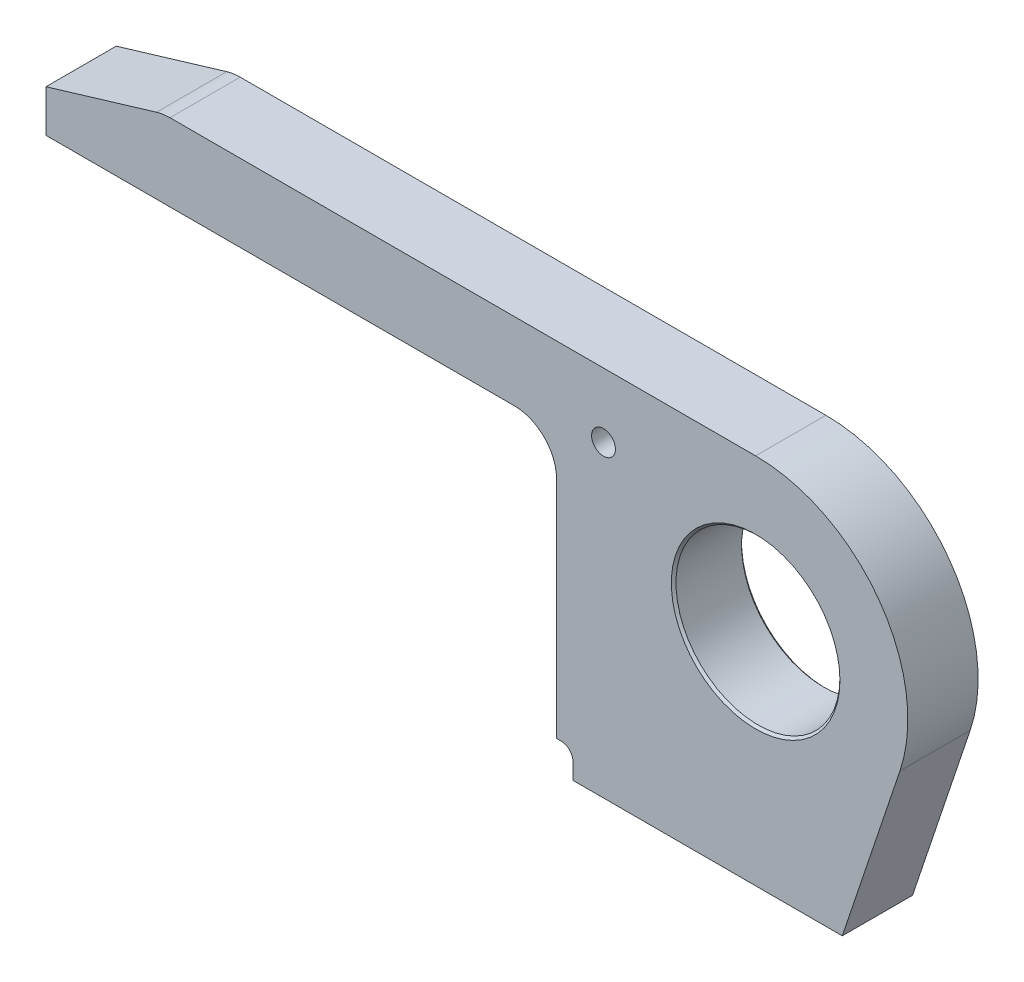
ISO-10303-21;
HEADER;
FILE_DESCRIPTION(('STEP AP214'),'2;1');
FILE_NAME('part.step','',(''),(''),'','','');
FILE_SCHEMA(('AUTOMOTIVE_DESIGN { 1 0 10303 214 1 1 1 1 }'));
ENDSEC;
DATA;
#1=APPLICATION_CONTEXT('core data for automotive mechanical design processes');
#2=APPLICATION_PROTOCOL_DEFINITION('international standard','automotive_design',2000,#1);
#3=PRODUCT_CONTEXT('',#1,'mechanical');
#4=PRODUCT('Part','Part','',(#3));
#5=PRODUCT_RELATED_PRODUCT_CATEGORY('part','',(#4));
#6=PRODUCT_DEFINITION_FORMATION('','',#4);
#7=PRODUCT_DEFINITION_CONTEXT('part definition',#1,'design');
#8=PRODUCT_DEFINITION('design','',#6,#7);
#9=PRODUCT_DEFINITION_SHAPE('','',#8);
#10=(LENGTH_UNIT() NAMED_UNIT(*) SI_UNIT(.MILLI.,.METRE.));
#11=(NAMED_UNIT(*) PLANE_ANGLE_UNIT() SI_UNIT($,.RADIAN.));
#12=(NAMED_UNIT(*) SI_UNIT($,.STERADIAN.) SOLID_ANGLE_UNIT());
#13=UNCERTAINTY_MEASURE_WITH_UNIT(LENGTH_MEASURE(1.E-05),#10,'distance_accuracy_value','');
#14=(GEOMETRIC_REPRESENTATION_CONTEXT(3) GLOBAL_UNCERTAINTY_ASSIGNED_CONTEXT((#13)) GLOBAL_UNIT_ASSIGNED_CONTEXT((#10,
#11,#12)) REPRESENTATION_CONTEXT('',''));
#15=CARTESIAN_POINT('',(0.,0.,0.));
#16=DIRECTION('',(0.,0.,1.));
#17=DIRECTION('',(1.,0.,0.));
#18=AXIS2_PLACEMENT_3D('',#15,#16,#17);
#19=CARTESIAN_POINT('',(-303.,27.0000000000002,-30.0000000000006));
#20=DIRECTION('',(0.,-1.,0.));
#21=DIRECTION('',(0.,0.,-1.00000000000001));
#22=AXIS2_PLACEMENT_3D('',#19,#20,#21);
#23=PLANE('',#22);
#24=DIRECTION('',(0.,0.,1.00000000000001));
#25=VECTOR('',#24,1.);
#26=CARTESIAN_POINT('',(-303.,27.0000000000002,-30.0000000000006));
#27=LINE('',#26,#25);
#28=CARTESIAN_POINT('',(-303.,27.0000000000002,-25.0000000000004));
#29=VERTEX_POINT('',#28);
#30=CARTESIAN_POINT('',(-303.,27.0000000000002,-5.00000000000056));
#31=VERTEX_POINT('',#30);
#32=EDGE_CURVE('E1529',#29,#31,#27,.T.);
#33=ORIENTED_EDGE('',*,*,#32,.F.);
#34=DIRECTION('',(1.,0.,0.));
#35=VECTOR('',#34,1.);
#36=CARTESIAN_POINT('',(-103.,27.0000000000001,-25.0000000000003));
#37=LINE('',#36,#35);
#38=CARTESIAN_POINT('',(-103.,27.0000000000001,-25.0000000000003));
#39=VERTEX_POINT('',#38);
#40=EDGE_CURVE('E1564',#29,#39,#37,.T.);
#41=ORIENTED_EDGE('',*,*,#40,.T.);
#42=DIRECTION('',(0.,0.,1.00000000000001));
#43=VECTOR('',#42,1.);
#44=CARTESIAN_POINT('',(-103.,27.0000000000001,-2.22044604925031E-13));
#45=LINE('',#44,#43);
#46=CARTESIAN_POINT('',(-103.,27.0000000000001,-5.00000000000034));
#47=VERTEX_POINT('',#46);
#48=EDGE_CURVE('E1549',#39,#47,#45,.T.);
#49=ORIENTED_EDGE('',*,*,#48,.T.);
#50=DIRECTION('',(-1.,0.,0.));
#51=VECTOR('',#50,1.);
#52=CARTESIAN_POINT('',(-303.,27.0000000000002,-5.00000000000056));
#53=LINE('',#52,#51);
#54=EDGE_CURVE('E1562',#47,#31,#53,.T.);
#55=ORIENTED_EDGE('',*,*,#54,.T.);
#56=EDGE_LOOP('',(#33,#41,#49,#55));
#57=FACE_BOUND('',#56,.T.);
#58=ADVANCED_FACE('F1349',(#57),#23,.T.);
#59=CARTESIAN_POINT('',(-303.,50.0000000000002,-30.0000000000006));
#60=DIRECTION('',(-1.,0.,0.));
#61=DIRECTION('',(0.,0.,1.00000000000001));
#62=AXIS2_PLACEMENT_3D('',#59,#60,#61);
#63=PLANE('',#62);
#64=DIRECTION('',(0.,-1.,0.));
#65=VECTOR('',#64,1.);
#66=CARTESIAN_POINT('',(-303.,50.0000000000002,-30.0000000000006));
#67=LINE('',#66,#65);
#68=CARTESIAN_POINT('',(-303.,50.0000000000002,-30.0000000000006));
#69=VERTEX_POINT('',#68);
#70=CARTESIAN_POINT('',(-303.,32.0000000000002,-30.0000000000006));
#71=VERTEX_POINT('',#70);
#72=EDGE_CURVE('E1488',#69,#71,#67,.T.);
#73=ORIENTED_EDGE('',*,*,#72,.T.);
#74=DIRECTION('',(0.,-0.707106781186544,0.707106781186556));
#75=VECTOR('',#74,1.);
#76=CARTESIAN_POINT('',(-303.000000000001,41.0000000000001,-39.0000000000004));
#77=LINE('',#76,#75);
#78=EDGE_CURVE('E1575',#71,#29,#77,.T.);
#79=ORIENTED_EDGE('',*,*,#78,.T.);
#80=ORIENTED_EDGE('',*,*,#32,.T.);
#81=DIRECTION('',(0.,-0.707106781186544,-0.707106781186556));
#82=VECTOR('',#81,1.);
#83=CARTESIAN_POINT('',(-303.000000000001,26.0000000000001,-6.00000000000067));
#84=LINE('',#83,#82);
#85=CARTESIAN_POINT('',(-303.,32.0000000000002,0.));
#86=VERTEX_POINT('',#85);
#87=EDGE_CURVE('E1573',#31,#86,#84,.F.);
#88=ORIENTED_EDGE('',*,*,#87,.T.);
#89=DIRECTION('',(0.,-1.,0.));
#90=VECTOR('',#89,1.);
#91=CARTESIAN_POINT('',(-303.,50.0000000000002,0.));
#92=LINE('',#91,#90);
#93=CARTESIAN_POINT('',(-303.,50.0000000000002,0.));
#94=VERTEX_POINT('',#93);
#95=EDGE_CURVE('E1526',#94,#86,#92,.T.);
#96=ORIENTED_EDGE('',*,*,#95,.F.);
#97=DIRECTION('',(0.,0.,1.00000000000001));
#98=VECTOR('',#97,1.);
#99=CARTESIAN_POINT('',(-303.,50.0000000000002,-30.0000000000006));
#100=LINE('',#99,#98);
#101=EDGE_CURVE('E1533',#69,#94,#100,.T.);
#102=ORIENTED_EDGE('',*,*,#101,.F.);
#103=EDGE_LOOP('',(#73,#79,#80,#88,#96,#102));
#104=FACE_BOUND('',#103,.T.);
#105=ADVANCED_FACE('F1688',(#104),#63,.T.);
#106=CARTESIAN_POINT('',(-303.,50.0000000000002,-30.0000000000006));
#107=DIRECTION('',(-0.287347885566347,0.957826285221151,0.));
#108=DIRECTION('',(-0.957826285221152,-0.287347885566345,0.));
#109=AXIS2_PLACEMENT_3D('',#106,#107,#108);
#110=PLANE('',#109);
#111=DIRECTION('',(-0.957826285221152,-0.287347885566345,0.));
#112=VECTOR('',#111,1.);
#113=CARTESIAN_POINT('',(-303.,50.0000000000002,0.));
#114=LINE('',#113,#112);
#115=CARTESIAN_POINT('',(-255.811580985257,64.1565257044233,0.));
#116=VERTEX_POINT('',#115);
#117=EDGE_CURVE('E1524',#116,#94,#114,.T.);
#118=ORIENTED_EDGE('',*,*,#117,.F.);
#119=DIRECTION('',(0.,0.,1.00000000000001));
#120=VECTOR('',#119,1.);
#121=CARTESIAN_POINT('',(-255.811580985257,64.1565257044233,-30.0000000000006));
#122=LINE('',#121,#120);
#123=CARTESIAN_POINT('',(-255.811580985257,64.1565257044233,-30.0000000000006));
#124=VERTEX_POINT('',#123);
#125=EDGE_CURVE('E1545',#116,#124,#122,.F.);
#126=ORIENTED_EDGE('',*,*,#125,.T.);
#127=DIRECTION('',(-0.957826285221152,-0.287347885566345,0.));
#128=VECTOR('',#127,1.);
#129=CARTESIAN_POINT('',(-303.,50.0000000000002,-30.0000000000006));
#130=LINE('',#129,#128);
#131=EDGE_CURVE('E1505',#124,#69,#130,.T.);
#132=ORIENTED_EDGE('',*,*,#131,.T.);
#133=ORIENTED_EDGE('',*,*,#101,.T.);
#134=EDGE_LOOP('',(#118,#126,#132,#133));
#135=FACE_BOUND('',#134,.T.);
#136=ADVANCED_FACE('F1722',(#135),#110,.T.);
#137=CARTESIAN_POINT('',(0.,65.0000000000001,-30.0000000000001));
#138=DIRECTION('',(0.,1.,0.));
#139=DIRECTION('',(-1.,0.,0.));
#140=AXIS2_PLACEMENT_3D('',#137,#138,#139);
#141=PLANE('',#140);
#142=DIRECTION('',(-1.,0.,0.));
#143=VECTOR('',#142,1.);
#144=CARTESIAN_POINT('',(0.,65.0000000000001,-30.0000000000001));
#145=LINE('',#144,#143);
#146=CARTESIAN_POINT('',(0.,65.0000000000001,-30.0000000000001));
#147=VERTEX_POINT('',#146);
#148=CARTESIAN_POINT('',(-250.06462327393,65.0000000000002,-30.0000000000002));
#149=VERTEX_POINT('',#148);
#150=EDGE_CURVE('E1502',#147,#149,#145,.T.);
#151=ORIENTED_EDGE('',*,*,#150,.T.);
#152=DIRECTION('',(0.,0.,1.00000000000001));
#153=VECTOR('',#152,1.);
#154=CARTESIAN_POINT('',(-250.06462327393,65.0000000000002,-30.0000000000002));
#155=LINE('',#154,#153);
#156=CARTESIAN_POINT('',(-250.06462327393,65.0000000000002,0.));
#157=VERTEX_POINT('',#156);
#158=EDGE_CURVE('E1532',#149,#157,#155,.T.);
#159=ORIENTED_EDGE('',*,*,#158,.T.);
#160=DIRECTION('',(-1.,0.,0.));
#161=VECTOR('',#160,1.);
#162=CARTESIAN_POINT('',(0.,65.0000000000001,0.));
#163=LINE('',#162,#161);
#164=CARTESIAN_POINT('',(0.,65.0000000000001,0.));
#165=VERTEX_POINT('',#164);
#166=EDGE_CURVE('E1521',#165,#157,#163,.T.);
#167=ORIENTED_EDGE('',*,*,#166,.F.);
#168=DIRECTION('',(0.,0.,1.00000000000001));
#169=VECTOR('',#168,1.);
#170=CARTESIAN_POINT('',(0.,65.0000000000001,-30.0000000000001));
#171=LINE('',#170,#169);
#172=EDGE_CURVE('E1536',#147,#165,#171,.T.);
#173=ORIENTED_EDGE('',*,*,#172,.F.);
#174=EDGE_LOOP('',(#151,#159,#167,#173));
#175=FACE_BOUND('',#174,.T.);
#176=ADVANCED_FACE('F1701',(#175),#141,.T.);
#177=CARTESIAN_POINT('',(0.,0.,-30.0000000000001));
#178=DIRECTION('',(0.,0.,1.00000000000001));
#179=DIRECTION('',(1.,0.,0.));
#180=AXIS2_PLACEMENT_3D('',#177,#178,#179);
#181=CYLINDRICAL_SURFACE('',#180,65.);
#182=CARTESIAN_POINT('',(0.,0.,0.));
#183=DIRECTION('',(0.,0.,1.00000000000001));
#184=DIRECTION('',(1.,0.,0.));
#185=AXIS2_PLACEMENT_3D('',#182,#183,#184);
#186=CIRCLE('',#185,65.);
#187=CARTESIAN_POINT('',(61.6182370278482,-20.6928215954215,0.));
#188=VERTEX_POINT('',#187);
#189=EDGE_CURVE('E1518',#188,#165,#186,.T.);
#190=ORIENTED_EDGE('',*,*,#189,.F.);
#191=DIRECTION('',(0.,0.,1.00000000000001));
#192=VECTOR('',#191,1.);
#193=CARTESIAN_POINT('',(61.6182370278482,-20.6928215954215,-30.0000000000004));
#194=LINE('',#193,#192);
#195=CARTESIAN_POINT('',(61.6182370278482,-20.6928215954215,-30.0000000000004));
#196=VERTEX_POINT('',#195);
#197=EDGE_CURVE('E1538',#196,#188,#194,.T.);
#198=ORIENTED_EDGE('',*,*,#197,.F.);
#199=CARTESIAN_POINT('',(0.,0.,-30.0000000000001));
#200=DIRECTION('',(0.,0.,1.00000000000001));
#201=DIRECTION('',(1.,0.,0.));
#202=AXIS2_PLACEMENT_3D('',#199,#200,#201);
#203=CIRCLE('',#202,65.);
#204=EDGE_CURVE('E1496',#196,#147,#203,.T.);
#205=ORIENTED_EDGE('',*,*,#204,.T.);
#206=ORIENTED_EDGE('',*,*,#172,.T.);
#207=EDGE_LOOP('',(#190,#198,#205,#206));
#208=FACE_BOUND('',#207,.T.);
#209=ADVANCED_FACE('F1706',(#208),#181,.T.);
#210=CARTESIAN_POINT('',(37.0000000000008,-93.9999999999998,-30.0000000000002));
#211=DIRECTION('',(0.947972877351507,-0.318351101468024,0.));
#212=DIRECTION('',(0.318351101468023,0.947972877351508,0.));
#213=AXIS2_PLACEMENT_3D('',#210,#211,#212);
#214=PLANE('',#213);
#215=DIRECTION('',(0.318351101468022,0.947972877351508,0.));
#216=VECTOR('',#215,1.);
#217=CARTESIAN_POINT('',(37.0000000000008,-93.9999999999998,0.));
#218=LINE('',#217,#216);
#219=CARTESIAN_POINT('',(37.0000000000008,-93.9999999999998,0.));
#220=VERTEX_POINT('',#219);
#221=EDGE_CURVE('E1515',#220,#188,#218,.T.);
#222=ORIENTED_EDGE('',*,*,#221,.F.);
#223=DIRECTION('',(0.,0.,1.00000000000001));
#224=VECTOR('',#223,1.);
#225=CARTESIAN_POINT('',(37.0000000000008,-93.9999999999998,-30.0000000000002));
#226=LINE('',#225,#224);
#227=CARTESIAN_POINT('',(37.0000000000008,-93.9999999999998,-30.0000000000002));
#228=VERTEX_POINT('',#227);
#229=EDGE_CURVE('E1487',#228,#220,#226,.T.);
#230=ORIENTED_EDGE('',*,*,#229,.F.);
#231=DIRECTION('',(0.318351101468022,0.947972877351508,0.));
#232=VECTOR('',#231,1.);
#233=CARTESIAN_POINT('',(37.0000000000008,-93.9999999999998,-30.0000000000002));
#234=LINE('',#233,#232);
#235=EDGE_CURVE('E1494',#228,#196,#234,.T.);
#236=ORIENTED_EDGE('',*,*,#235,.T.);
#237=ORIENTED_EDGE('',*,*,#197,.T.);
#238=EDGE_LOOP('',(#222,#230,#236,#237));
#239=FACE_BOUND('',#238,.T.);
#240=ADVANCED_FACE('F1708',(#239),#214,.T.);
#241=CARTESIAN_POINT('',(-77.999999999999,-93.9999999999995,-30.0000000000004));
#242=DIRECTION('',(0.,-1.,0.));
#243=DIRECTION('',(0.,0.,-1.00000000000001));
#244=AXIS2_PLACEMENT_3D('',#241,#242,#243);
#245=PLANE('',#244);
#246=DIRECTION('',(1.,0.,0.));
#247=VECTOR('',#246,1.);
#248=CARTESIAN_POINT('',(-77.999999999999,-93.9999999999995,-2.22044604925031E-13));
#249=LINE('',#248,#247);
#250=CARTESIAN_POINT('',(-77.999999999999,-93.9999999999995,-2.22044604925031E-13));
#251=VERTEX_POINT('',#250);
#252=EDGE_CURVE('E1486',#251,#220,#249,.T.);
#253=ORIENTED_EDGE('',*,*,#252,.F.);
#254=DIRECTION('',(0.,0.,1.00000000000001));
#255=VECTOR('',#254,1.);
#256=CARTESIAN_POINT('',(-77.999999999999,-93.9999999999995,-30.0000000000004));
#257=LINE('',#256,#255);
#258=CARTESIAN_POINT('',(-77.999999999999,-93.9999999999995,-30.0000000000004));
#259=VERTEX_POINT('',#258);
#260=EDGE_CURVE('E1471',#259,#251,#257,.T.);
#261=ORIENTED_EDGE('',*,*,#260,.F.);
#262=DIRECTION('',(1.,0.,0.));
#263=VECTOR('',#262,1.);
#264=CARTESIAN_POINT('',(-77.999999999999,-93.9999999999995,-30.0000000000004));
#265=LINE('',#264,#263);
#266=EDGE_CURVE('E1479',#259,#228,#265,.T.);
#267=ORIENTED_EDGE('',*,*,#266,.T.);
#268=ORIENTED_EDGE('',*,*,#229,.T.);
#269=EDGE_LOOP('',(#253,#261,#267,#268));
#270=FACE_BOUND('',#269,.T.);
#271=ADVANCED_FACE('F1484',(#270),#245,.T.);
#272=CARTESIAN_POINT('',(-77.999999999999,-81.9999999999996,-30.0000000000004));
#273=DIRECTION('',(-1.,0.,0.));
#274=DIRECTION('',(0.,0.,1.00000000000001));
#275=AXIS2_PLACEMENT_3D('',#272,#273,#274);
#276=PLANE('',#275);
#277=DIRECTION('',(0.,-1.,0.));
#278=VECTOR('',#277,1.);
#279=CARTESIAN_POINT('',(-77.999999999999,-81.9999999999996,-2.22044604925031E-13));
#280=LINE('',#279,#278);
#281=CARTESIAN_POINT('',(-77.999999999999,-86.9999999999996,-2.22044604925031E-13));
#282=VERTEX_POINT('',#281);
#283=EDGE_CURVE('E1511',#282,#251,#280,.T.);
#284=ORIENTED_EDGE('',*,*,#283,.F.);
#285=DIRECTION('',(0.,0.,1.00000000000001));
#286=VECTOR('',#285,1.);
#287=CARTESIAN_POINT('',(-77.999999999999,-86.9999999999996,-30.0000000000004));
#288=LINE('',#287,#286);
#289=CARTESIAN_POINT('',(-77.999999999999,-86.9999999999996,-30.0000000000004));
#290=VERTEX_POINT('',#289);
#291=EDGE_CURVE('E1474',#282,#290,#288,.F.);
#292=ORIENTED_EDGE('',*,*,#291,.T.);
#293=DIRECTION('',(0.,-1.,0.));
#294=VECTOR('',#293,1.);
#295=CARTESIAN_POINT('',(-77.999999999999,-81.9999999999996,-30.0000000000004));
#296=LINE('',#295,#294);
#297=EDGE_CURVE('E1467',#290,#259,#296,.T.);
#298=ORIENTED_EDGE('',*,*,#297,.T.);
#299=ORIENTED_EDGE('',*,*,#260,.T.);
#300=EDGE_LOOP('',(#284,#292,#298,#299));
#301=FACE_BOUND('',#300,.T.);
#302=ADVANCED_FACE('F1470',(#301),#276,.T.);
#303=CARTESIAN_POINT('',(-89.999999999999,-82.,-30.0000000000004));
#304=DIRECTION('',(0.,-1.,0.));
#305=DIRECTION('',(0.,0.,-1.00000000000001));
#306=AXIS2_PLACEMENT_3D('',#303,#304,#305);
#307=PLANE('',#306);
#308=DIRECTION('',(1.,0.,0.));
#309=VECTOR('',#308,1.);
#310=CARTESIAN_POINT('',(-89.999999999999,-82.,-2.22044604925031E-13));
#311=LINE('',#310,#309);
#312=CARTESIAN_POINT('',(-84.9999999999991,-82.,-4.44089209850063E-13));
#313=VERTEX_POINT('',#312);
#314=CARTESIAN_POINT('',(-82.9999999999993,-82.,-4.44089209850063E-13));
#315=VERTEX_POINT('',#314);
#316=EDGE_CURVE('E1509',#313,#315,#311,.T.);
#317=ORIENTED_EDGE('',*,*,#316,.F.);
#318=DIRECTION('',(0.,0.,-1.00000000000001));
#319=VECTOR('',#318,1.);
#320=CARTESIAN_POINT('',(-84.9999999999991,-82.,-30.0000000000006));
#321=LINE('',#320,#319);
#322=CARTESIAN_POINT('',(-84.9999999999991,-82.,-30.0000000000006));
#323=VERTEX_POINT('',#322);
#324=EDGE_CURVE('E1591',#313,#323,#321,.T.);
#325=ORIENTED_EDGE('',*,*,#324,.T.);
#326=DIRECTION('',(1.,0.,0.));
#327=VECTOR('',#326,1.);
#328=CARTESIAN_POINT('',(-89.999999999999,-82.,-30.0000000000004));
#329=LINE('',#328,#327);
#330=CARTESIAN_POINT('',(-82.9999999999993,-82.,-30.0000000000006));
#331=VERTEX_POINT('',#330);
#332=EDGE_CURVE('E1480',#323,#331,#329,.T.);
#333=ORIENTED_EDGE('',*,*,#332,.T.);
#334=DIRECTION('',(0.,0.,1.00000000000001));
#335=VECTOR('',#334,1.);
#336=CARTESIAN_POINT('',(-82.9999999999993,-82.,-4.44089209850063E-13));
#337=LINE('',#336,#335);
#338=EDGE_CURVE('E1554',#331,#315,#337,.T.);
#339=ORIENTED_EDGE('',*,*,#338,.T.);
#340=EDGE_LOOP('',(#317,#325,#333,#339));
#341=FACE_BOUND('',#340,.T.);
#342=ADVANCED_FACE('F1642',(#341),#307,.T.);
#343=CARTESIAN_POINT('',(-89.9999999999999,27.0000000000001,-30.0000000000004));
#344=DIRECTION('',(-1.,0.,0.));
#345=DIRECTION('',(0.,-1.,0.));
#346=AXIS2_PLACEMENT_3D('',#343,#344,#345);
#347=PLANE('',#346);
#348=DIRECTION('',(0.,0.,1.00000000000001));
#349=VECTOR('',#348,1.);
#350=CARTESIAN_POINT('',(-89.9999999999999,14.0000000000002,-30.0000000000004));
#351=LINE('',#350,#349);
#352=CARTESIAN_POINT('',(-90.0000000000001,14.0000000000001,-5.00000000000034));
#353=VERTEX_POINT('',#352);
#354=CARTESIAN_POINT('',(-89.9999999999999,14.0000000000001,-25.0000000000002));
#355=VERTEX_POINT('',#354);
#356=EDGE_CURVE('E1552',#353,#355,#351,.F.);
#357=ORIENTED_EDGE('',*,*,#356,.T.);
#358=DIRECTION('',(0.,-1.,0.));
#359=VECTOR('',#358,1.);
#360=CARTESIAN_POINT('',(-89.9999999999999,-82.,-25.0000000000002));
#361=LINE('',#360,#359);
#362=CARTESIAN_POINT('',(-89.9999999999999,-77.,-25.0000000000002));
#363=VERTEX_POINT('',#362);
#364=EDGE_CURVE('E1364',#355,#363,#361,.T.);
#365=ORIENTED_EDGE('',*,*,#364,.T.);
#366=DIRECTION('',(0.,0.,1.00000000000001));
#367=VECTOR('',#366,1.);
#368=CARTESIAN_POINT('',(-89.999999999999,-77.,-30.0000000000004));
#369=LINE('',#368,#367);
#370=CARTESIAN_POINT('',(-89.9999999999999,-77.,-5.00000000000034));
#371=VERTEX_POINT('',#370);
#372=EDGE_CURVE('E1368',#363,#371,#369,.T.);
#373=ORIENTED_EDGE('',*,*,#372,.T.);
#374=DIRECTION('',(0.,1.,0.));
#375=VECTOR('',#374,1.);
#376=CARTESIAN_POINT('',(-89.9999999999999,27.0000000000001,-5.00000000000034));
#377=LINE('',#376,#375);
#378=EDGE_CURVE('E1587',#371,#353,#377,.T.);
#379=ORIENTED_EDGE('',*,*,#378,.T.);
#380=EDGE_LOOP('',(#357,#365,#373,#379));
#381=FACE_BOUND('',#380,.T.);
#382=ADVANCED_FACE('F1631',(#381),#347,.T.);
#383=CARTESIAN_POINT('',(0.,0.,-30.0000000000001));
#384=DIRECTION('',(0.,0.,1.00000000000001));
#385=DIRECTION('',(1.,0.,0.));
#386=AXIS2_PLACEMENT_3D('',#383,#384,#385);
#387=PLANE('',#386);
#388=CARTESIAN_POINT('',(0.,0.,-30.0000000000001));
#389=DIRECTION('',(0.,0.,1.00000000000001));
#390=DIRECTION('',(1.,0.,0.));
#391=AXIS2_PLACEMENT_3D('',#388,#389,#390);
#392=CIRCLE('',#391,36.0000000000001);
#393=CARTESIAN_POINT('',(36.0000000000001,0.,-30.0000000000001));
#394=VERTEX_POINT('',#393);
#395=EDGE_CURVE('E1593',#394,#394,#392,.T.);
#396=ORIENTED_EDGE('',*,*,#395,.T.);
#397=EDGE_LOOP('',(#396));
#398=FACE_BOUND('',#397,.T.);
#399=CARTESIAN_POINT('',(-64.951905283833,37.4999999999997,-30.0000000000002));
#400=DIRECTION('',(0.,0.,1.00000000000001));
#401=DIRECTION('',(1.,0.,0.));
#402=AXIS2_PLACEMENT_3D('',#399,#400,#401);
#403=CIRCLE('',#402,5.09999999999999);
#404=CARTESIAN_POINT('',(-59.851905283833,37.4999999999997,-30.0000000000002));
#405=VERTEX_POINT('',#404);
#406=EDGE_CURVE('E1512',#405,#405,#403,.T.);
#407=ORIENTED_EDGE('',*,*,#406,.T.);
#408=EDGE_LOOP('',(#407));
#409=FACE_BOUND('',#408,.T.);
#410=CARTESIAN_POINT('',(-103.,14.0000000000002,-30.0000000000005));
#411=DIRECTION('',(0.,0.,1.00000000000001));
#412=DIRECTION('',(1.,0.,0.));
#413=AXIS2_PLACEMENT_3D('',#410,#411,#412);
#414=CIRCLE('',#413,18.);
#415=CARTESIAN_POINT('',(-85.,14.0000000000001,-30.0000000000006));
#416=VERTEX_POINT('',#415);
#417=CARTESIAN_POINT('',(-103.,32.0000000000001,-30.0000000000005));
#418=VERTEX_POINT('',#417);
#419=EDGE_CURVE('E1569',#416,#418,#414,.T.);
#420=ORIENTED_EDGE('',*,*,#419,.T.);
#421=DIRECTION('',(-1.,0.,0.));
#422=VECTOR('',#421,1.);
#423=CARTESIAN_POINT('',(-303.,32.0000000000002,-30.0000000000006));
#424=LINE('',#423,#422);
#425=EDGE_CURVE('E1571',#418,#71,#424,.T.);
#426=ORIENTED_EDGE('',*,*,#425,.T.);
#427=ORIENTED_EDGE('',*,*,#72,.F.);
#428=ORIENTED_EDGE('',*,*,#131,.F.);
#429=CARTESIAN_POINT('',(-250.06462327393,45.0000000000002,-30.0000000000002));
#430=DIRECTION('',(0.,0.,1.00000000000001));
#431=DIRECTION('',(1.,0.,0.));
#432=AXIS2_PLACEMENT_3D('',#429,#430,#431);
#433=CIRCLE('',#432,20.);
#434=EDGE_CURVE('E1547',#124,#149,#433,.F.);
#435=ORIENTED_EDGE('',*,*,#434,.T.);
#436=ORIENTED_EDGE('',*,*,#150,.F.);
#437=ORIENTED_EDGE('',*,*,#204,.F.);
#438=ORIENTED_EDGE('',*,*,#235,.F.);
#439=ORIENTED_EDGE('',*,*,#266,.F.);
#440=ORIENTED_EDGE('',*,*,#297,.F.);
#441=CARTESIAN_POINT('',(-82.9999999999993,-87.,-30.0000000000006));
#442=DIRECTION('',(0.,0.,1.00000000000001));
#443=DIRECTION('',(1.,0.,0.));
#444=AXIS2_PLACEMENT_3D('',#441,#442,#443);
#445=CIRCLE('',#444,5.);
#446=EDGE_CURVE('E1560',#290,#331,#445,.T.);
#447=ORIENTED_EDGE('',*,*,#446,.T.);
#448=ORIENTED_EDGE('',*,*,#332,.F.);
#449=DIRECTION('',(0.,1.,0.));
#450=VECTOR('',#449,1.);
#451=CARTESIAN_POINT('',(-85.,14.0000000000001,-30.0000000000006));
#452=LINE('',#451,#450);
#453=EDGE_CURVE('E1567',#323,#416,#452,.T.);
#454=ORIENTED_EDGE('',*,*,#453,.T.);
#455=EDGE_LOOP('',(#420,#426,#427,#428,#435,#436,#437,#438,#439,#440,#447,#448,#454));
#456=FACE_BOUND('',#455,.T.);
#457=ADVANCED_FACE('F1491',(#398,#409,#456),#387,.F.);
#458=CARTESIAN_POINT('',(0.,0.,0.));
#459=DIRECTION('',(0.,0.,1.00000000000001));
#460=DIRECTION('',(1.,0.,0.));
#461=AXIS2_PLACEMENT_3D('',#458,#459,#460);
#462=PLANE('',#461);
#463=CARTESIAN_POINT('',(0.,0.,0.));
#464=DIRECTION('',(0.,0.,1.00000000000001));
#465=DIRECTION('',(1.,0.,0.));
#466=AXIS2_PLACEMENT_3D('',#463,#464,#465);
#467=CIRCLE('',#466,36.);
#468=CARTESIAN_POINT('',(36.,0.,0.));
#469=VERTEX_POINT('',#468);
#470=EDGE_CURVE('E12',#469,#469,#467,.F.);
#471=ORIENTED_EDGE('',*,*,#470,.T.);
#472=EDGE_LOOP('',(#471));
#473=FACE_BOUND('',#472,.T.);
#474=CARTESIAN_POINT('',(-64.951905283833,37.4999999999997,0.));
#475=DIRECTION('',(0.,0.,1.00000000000001));
#476=DIRECTION('',(1.,0.,0.));
#477=AXIS2_PLACEMENT_3D('',#474,#475,#476);
#478=CIRCLE('',#477,5.09999999999999);
#479=CARTESIAN_POINT('',(-59.851905283833,37.4999999999997,0.));
#480=VERTEX_POINT('',#479);
#481=EDGE_CURVE('E1611',#480,#480,#478,.T.);
#482=ORIENTED_EDGE('',*,*,#481,.F.);
#483=EDGE_LOOP('',(#482));
#484=FACE_BOUND('',#483,.T.);
#485=ORIENTED_EDGE('',*,*,#95,.T.);
#486=DIRECTION('',(1.,0.,0.));
#487=VECTOR('',#486,1.);
#488=CARTESIAN_POINT('',(0.,32.,0.));
#489=LINE('',#488,#487);
#490=CARTESIAN_POINT('',(-103.,32.0000000000001,-2.22044604925031E-13));
#491=VERTEX_POINT('',#490);
#492=EDGE_CURVE('E1581',#86,#491,#489,.T.);
#493=ORIENTED_EDGE('',*,*,#492,.T.);
#494=CARTESIAN_POINT('',(-103.,14.0000000000001,-2.22044604925031E-13));
#495=DIRECTION('',(0.,0.,1.00000000000001));
#496=DIRECTION('',(1.,0.,0.));
#497=AXIS2_PLACEMENT_3D('',#494,#495,#496);
#498=CIRCLE('',#497,18.);
#499=CARTESIAN_POINT('',(-85.,14.0000000000001,-4.44089209850063E-13));
#500=VERTEX_POINT('',#499);
#501=EDGE_CURVE('E1579',#491,#500,#498,.F.);
#502=ORIENTED_EDGE('',*,*,#501,.T.);
#503=DIRECTION('',(0.,-1.,0.));
#504=VECTOR('',#503,1.);
#505=CARTESIAN_POINT('',(-85.,1.2490009027033E-13,-4.44089209850063E-13));
#506=LINE('',#505,#504);
#507=EDGE_CURVE('E1577',#500,#313,#506,.T.);
#508=ORIENTED_EDGE('',*,*,#507,.T.);
#509=ORIENTED_EDGE('',*,*,#316,.T.);
#510=CARTESIAN_POINT('',(-82.9999999999993,-87.,-4.44089209850063E-13));
#511=DIRECTION('',(0.,0.,1.00000000000001));
#512=DIRECTION('',(1.,0.,0.));
#513=AXIS2_PLACEMENT_3D('',#510,#511,#512);
#514=CIRCLE('',#513,5.);
#515=EDGE_CURVE('E1558',#315,#282,#514,.F.);
#516=ORIENTED_EDGE('',*,*,#515,.T.);
#517=ORIENTED_EDGE('',*,*,#283,.T.);
#518=ORIENTED_EDGE('',*,*,#252,.T.);
#519=ORIENTED_EDGE('',*,*,#221,.T.);
#520=ORIENTED_EDGE('',*,*,#189,.T.);
#521=ORIENTED_EDGE('',*,*,#166,.T.);
#522=CARTESIAN_POINT('',(-250.06462327393,45.0000000000002,0.));
#523=DIRECTION('',(0.,0.,1.00000000000001));
#524=DIRECTION('',(1.,0.,0.));
#525=AXIS2_PLACEMENT_3D('',#522,#523,#524);
#526=CIRCLE('',#525,20.);
#527=EDGE_CURVE('E1543',#157,#116,#526,.T.);
#528=ORIENTED_EDGE('',*,*,#527,.T.);
#529=ORIENTED_EDGE('',*,*,#117,.T.);
#530=EDGE_LOOP('',(#485,#493,#502,#508,#509,#516,#517,#518,#519,#520,#521,#528,#529));
#531=FACE_BOUND('',#530,.T.);
#532=ADVANCED_FACE('F1630',(#473,#484,#531),#462,.T.);
#533=CARTESIAN_POINT('',(0.,0.,-30.0000000000001));
#534=DIRECTION('',(0.,0.,1.00000000000001));
#535=DIRECTION('',(1.,0.,0.));
#536=AXIS2_PLACEMENT_3D('',#533,#534,#535);
#537=CYLINDRICAL_SURFACE('',#536,35.);
#538=CARTESIAN_POINT('',(0.,0.,-29.));
#539=DIRECTION('',(0.,0.,1.00000000000001));
#540=DIRECTION('',(1.,0.,0.));
#541=AXIS2_PLACEMENT_3D('',#538,#539,#540);
#542=CIRCLE('',#541,35.);
#543=CARTESIAN_POINT('',(35.,0.,-29.));
#544=VERTEX_POINT('',#543);
#545=EDGE_CURVE('E1357',#544,#544,#542,.F.);
#546=ORIENTED_EDGE('',*,*,#545,.T.);
#547=EDGE_LOOP('',(#546));
#548=FACE_BOUND('',#547,.T.);
#549=CARTESIAN_POINT('',(0.,0.,-1.));
#550=DIRECTION('',(0.,0.,1.00000000000001));
#551=DIRECTION('',(1.,0.,0.));
#552=AXIS2_PLACEMENT_3D('',#549,#550,#551);
#553=CIRCLE('',#552,35.);
#554=CARTESIAN_POINT('',(35.,0.,-0.999999999999964));
#555=VERTEX_POINT('',#554);
#556=EDGE_CURVE('E1614',#555,#555,#553,.T.);
#557=ORIENTED_EDGE('',*,*,#556,.T.);
#558=EDGE_LOOP('',(#557));
#559=FACE_BOUND('',#558,.T.);
#560=ADVANCED_FACE('F1619',(#548,#559),#537,.F.);
#561=CARTESIAN_POINT('',(-250.06462327393,45.0000000000002,-30.0000000000002));
#562=DIRECTION('',(0.,0.,1.00000000000001));
#563=DIRECTION('',(1.,0.,0.));
#564=AXIS2_PLACEMENT_3D('',#561,#562,#563);
#565=CYLINDRICAL_SURFACE('',#564,20.);
#566=ORIENTED_EDGE('',*,*,#434,.F.);
#567=ORIENTED_EDGE('',*,*,#125,.F.);
#568=ORIENTED_EDGE('',*,*,#527,.F.);
#569=ORIENTED_EDGE('',*,*,#158,.F.);
#570=EDGE_LOOP('',(#566,#567,#568,#569));
#571=FACE_BOUND('',#570,.T.);
#572=ADVANCED_FACE('F1698',(#571),#565,.T.);
#573=CARTESIAN_POINT('',(-103.,14.0000000000002,-30.0000000000005));
#574=DIRECTION('',(0.,0.,-1.00000000000001));
#575=DIRECTION('',(-1.,0.,0.));
#576=AXIS2_PLACEMENT_3D('',#573,#574,#575);
#577=CYLINDRICAL_SURFACE('',#576,13.);
#578=ORIENTED_EDGE('',*,*,#48,.F.);
#579=CARTESIAN_POINT('',(-103.,14.0000000000001,-25.0000000000003));
#580=DIRECTION('',(0.,0.,1.00000000000001));
#581=DIRECTION('',(1.,0.,0.));
#582=AXIS2_PLACEMENT_3D('',#579,#580,#581);
#583=CIRCLE('',#582,13.);
#584=EDGE_CURVE('E1585',#39,#355,#583,.F.);
#585=ORIENTED_EDGE('',*,*,#584,.T.);
#586=ORIENTED_EDGE('',*,*,#356,.F.);
#587=CARTESIAN_POINT('',(-103.,14.0000000000001,-5.00000000000034));
#588=DIRECTION('',(0.,0.,1.00000000000001));
#589=DIRECTION('',(1.,0.,0.));
#590=AXIS2_PLACEMENT_3D('',#587,#588,#589);
#591=CIRCLE('',#590,13.);
#592=EDGE_CURVE('E1583',#353,#47,#591,.T.);
#593=ORIENTED_EDGE('',*,*,#592,.T.);
#594=EDGE_LOOP('',(#578,#585,#586,#593));
#595=FACE_BOUND('',#594,.T.);
#596=ADVANCED_FACE('F1676',(#595),#577,.F.);
#597=CARTESIAN_POINT('',(-82.9999999999993,-87.,-30.0000000000006));
#598=DIRECTION('',(0.,0.,-1.00000000000001));
#599=DIRECTION('',(-1.,0.,0.));
#600=AXIS2_PLACEMENT_3D('',#597,#598,#599);
#601=CYLINDRICAL_SURFACE('',#600,5.);
#602=ORIENTED_EDGE('',*,*,#446,.F.);
#603=ORIENTED_EDGE('',*,*,#291,.F.);
#604=ORIENTED_EDGE('',*,*,#515,.F.);
#605=ORIENTED_EDGE('',*,*,#338,.F.);
#606=EDGE_LOOP('',(#602,#603,#604,#605));
#607=FACE_BOUND('',#606,.T.);
#608=ADVANCED_FACE('F1648',(#607),#601,.F.);
#609=CARTESIAN_POINT('',(-64.951905283833,37.4999999999997,0.));
#610=DIRECTION('',(0.,0.,1.00000000000001));
#611=DIRECTION('',(1.,0.,0.));
#612=AXIS2_PLACEMENT_3D('',#609,#610,#611);
#613=CYLINDRICAL_SURFACE('',#612,5.09999999999999);
#614=ORIENTED_EDGE('',*,*,#406,.F.);
#615=EDGE_LOOP('',(#614));
#616=FACE_BOUND('',#615,.T.);
#617=ORIENTED_EDGE('',*,*,#481,.T.);
#618=EDGE_LOOP('',(#617));
#619=FACE_BOUND('',#618,.T.);
#620=ADVANCED_FACE('F1733',(#616,#619),#613,.F.);
#621=CARTESIAN_POINT('',(0.,32.,0.));
#622=DIRECTION('',(0.,0.707106781186551,-0.707106781186548));
#623=DIRECTION('',(1.,0.,0.));
#624=AXIS2_PLACEMENT_3D('',#621,#622,#623);
#625=PLANE('',#624);
#626=ORIENTED_EDGE('',*,*,#87,.F.);
#627=ORIENTED_EDGE('',*,*,#54,.F.);
#628=DIRECTION('',(0.,-0.707106781186543,-0.707106781186556));
#629=VECTOR('',#628,1.);
#630=CARTESIAN_POINT('',(-103.,32.0000000000001,-2.22044604925031E-13));
#631=LINE('',#630,#629);
#632=EDGE_CURVE('E1608',#491,#47,#631,.T.);
#633=ORIENTED_EDGE('',*,*,#632,.F.);
#634=ORIENTED_EDGE('',*,*,#492,.F.);
#635=EDGE_LOOP('',(#626,#627,#633,#634));
#636=FACE_BOUND('',#635,.T.);
#637=ADVANCED_FACE('F1686',(#636),#625,.F.);
#638=CARTESIAN_POINT('',(-103.,14.0000000000001,-2.22044604925031E-13));
#639=DIRECTION('',(0.,0.,1.00000000000001));
#640=DIRECTION('',(1.,0.,0.));
#641=AXIS2_PLACEMENT_3D('',#638,#639,#640);
#642=CONICAL_SURFACE('',#641,18.,0.785398163397443);
#643=ORIENTED_EDGE('',*,*,#632,.T.);
#644=ORIENTED_EDGE('',*,*,#592,.F.);
#645=DIRECTION('',(-0.707106781186545,0.,-0.707106781186557));
#646=VECTOR('',#645,1.);
#647=CARTESIAN_POINT('',(-85.,14.0000000000001,-4.44089209850063E-13));
#648=LINE('',#647,#646);
#649=EDGE_CURVE('E1605',#500,#353,#648,.T.);
#650=ORIENTED_EDGE('',*,*,#649,.F.);
#651=ORIENTED_EDGE('',*,*,#501,.F.);
#652=EDGE_LOOP('',(#643,#644,#650,#651));
#653=FACE_BOUND('',#652,.T.);
#654=ADVANCED_FACE('F1680',(#653),#642,.F.);
#655=CARTESIAN_POINT('',(-85.,1.2490009027033E-13,-4.44089209850063E-13));
#656=DIRECTION('',(0.70710678118655,0.,-0.707106781186546));
#657=DIRECTION('',(0.,-1.,0.));
#658=AXIS2_PLACEMENT_3D('',#655,#656,#657);
#659=PLANE('',#658);
#660=ORIENTED_EDGE('',*,*,#649,.T.);
#661=ORIENTED_EDGE('',*,*,#378,.F.);
#662=DIRECTION('',(0.577350269189623,-0.577350269189629,0.577350269189632));
#663=VECTOR('',#662,1.);
#664=CARTESIAN_POINT('',(-112.333333333333,-54.6666666666664,-27.3333333333341));
#665=LINE('',#664,#663);
#666=EDGE_CURVE('E1602',#313,#371,#665,.F.);
#667=ORIENTED_EDGE('',*,*,#666,.F.);
#668=ORIENTED_EDGE('',*,*,#507,.F.);
#669=EDGE_LOOP('',(#660,#661,#667,#668));
#670=FACE_BOUND('',#669,.T.);
#671=ADVANCED_FACE('F1653',(#670),#659,.F.);
#672=CARTESIAN_POINT('',(-89.999999999999,-77.,-30.0000000000004));
#673=DIRECTION('',(0.707106781186552,0.707106781186544,0.));
#674=DIRECTION('',(0.,0.,1.00000000000001));
#675=AXIS2_PLACEMENT_3D('',#672,#673,#674);
#676=PLANE('',#675);
#677=ORIENTED_EDGE('',*,*,#666,.T.);
#678=ORIENTED_EDGE('',*,*,#372,.F.);
#679=DIRECTION('',(-0.577350269189621,0.577350269189629,0.577350269189632));
#680=VECTOR('',#679,1.);
#681=CARTESIAN_POINT('',(-88.3333333333325,-78.6666666666667,-26.666666666667));
#682=LINE('',#681,#680);
#683=EDGE_CURVE('E1599',#323,#363,#682,.T.);
#684=ORIENTED_EDGE('',*,*,#683,.F.);
#685=ORIENTED_EDGE('',*,*,#324,.F.);
#686=EDGE_LOOP('',(#677,#678,#684,#685));
#687=FACE_BOUND('',#686,.T.);
#688=ADVANCED_FACE('F1655',(#687),#676,.F.);
#689=CARTESIAN_POINT('',(-89.9999999999999,27.0000000000001,-25.0000000000002));
#690=DIRECTION('',(-0.707106781186553,0.,-0.707106781186549));
#691=DIRECTION('',(0.,1.,0.));
#692=AXIS2_PLACEMENT_3D('',#689,#690,#691);
#693=PLANE('',#692);
#694=ORIENTED_EDGE('',*,*,#683,.T.);
#695=ORIENTED_EDGE('',*,*,#364,.F.);
#696=DIRECTION('',(-0.707106781186542,0.,0.707106781186554));
#697=VECTOR('',#696,1.);
#698=CARTESIAN_POINT('',(-85.,14.0000000000001,-30.0000000000006));
#699=LINE('',#698,#697);
#700=EDGE_CURVE('E1596',#416,#355,#699,.T.);
#701=ORIENTED_EDGE('',*,*,#700,.F.);
#702=ORIENTED_EDGE('',*,*,#453,.F.);
#703=EDGE_LOOP('',(#694,#695,#701,#702));
#704=FACE_BOUND('',#703,.T.);
#705=ADVANCED_FACE('F1659',(#704),#693,.T.);
#706=CARTESIAN_POINT('',(-103.,14.0000000000002,-30.0000000000005));
#707=DIRECTION('',(0.,0.,-1.00000000000001));
#708=DIRECTION('',(-1.,0.,0.));
#709=AXIS2_PLACEMENT_3D('',#706,#707,#708);
#710=CONICAL_SURFACE('',#709,18.,0.785398163397443);
#711=ORIENTED_EDGE('',*,*,#700,.T.);
#712=ORIENTED_EDGE('',*,*,#584,.F.);
#713=DIRECTION('',(0.,-0.707106781186543,0.707106781186556));
#714=VECTOR('',#713,1.);
#715=CARTESIAN_POINT('',(-103.,32.0000000000001,-30.0000000000005));
#716=LINE('',#715,#714);
#717=EDGE_CURVE('E1594',#418,#39,#716,.T.);
#718=ORIENTED_EDGE('',*,*,#717,.F.);
#719=ORIENTED_EDGE('',*,*,#419,.F.);
#720=EDGE_LOOP('',(#711,#712,#718,#719));
#721=FACE_BOUND('',#720,.T.);
#722=ADVANCED_FACE('F1669',(#721),#710,.F.);
#723=CARTESIAN_POINT('',(-303.,27.0000000000002,-25.0000000000004));
#724=DIRECTION('',(0.,-0.707106781186551,-0.707106781186548));
#725=DIRECTION('',(-1.,0.,0.));
#726=AXIS2_PLACEMENT_3D('',#723,#724,#725);
#727=PLANE('',#726);
#728=ORIENTED_EDGE('',*,*,#78,.F.);
#729=ORIENTED_EDGE('',*,*,#425,.F.);
#730=ORIENTED_EDGE('',*,*,#717,.T.);
#731=ORIENTED_EDGE('',*,*,#40,.F.);
#732=EDGE_LOOP('',(#728,#729,#730,#731));
#733=FACE_BOUND('',#732,.T.);
#734=ADVANCED_FACE('F1625',(#733),#727,.T.);
#735=CARTESIAN_POINT('',(0.,0.,-30.0000000000001));
#736=DIRECTION('',(0.,0.,-1.00000000000001));
#737=DIRECTION('',(-1.,0.,0.));
#738=AXIS2_PLACEMENT_3D('',#735,#736,#737);
#739=CONICAL_SURFACE('',#738,36.0000000000001,0.785398163397448);
#740=ORIENTED_EDGE('',*,*,#545,.F.);
#741=EDGE_LOOP('',(#740));
#742=FACE_BOUND('',#741,.T.);
#743=ORIENTED_EDGE('',*,*,#395,.F.);
#744=EDGE_LOOP('',(#743));
#745=FACE_BOUND('',#744,.T.);
#746=ADVANCED_FACE('F1622',(#742,#745),#739,.F.);
#747=CARTESIAN_POINT('',(0.,0.,-1.));
#748=DIRECTION('',(0.,0.,1.00000000000001));
#749=DIRECTION('',(1.,0.,0.));
#750=AXIS2_PLACEMENT_3D('',#747,#748,#749);
#751=CONICAL_SURFACE('',#750,35.,0.785398163397473);
#752=ORIENTED_EDGE('',*,*,#470,.F.);
#753=EDGE_LOOP('',(#752));
#754=FACE_BOUND('',#753,.T.);
#755=ORIENTED_EDGE('',*,*,#556,.F.);
#756=EDGE_LOOP('',(#755));
#757=FACE_BOUND('',#756,.T.);
#758=ADVANCED_FACE('F1351',(#754,#757),#751,.F.);
#759=CLOSED_SHELL('',(#58,#105,#136,#176,#209,#240,#271,#302,#342,#382,#457,#532,#560,#572,#596,
#608,#620,#637,#654,#671,#688,#705,#722,#734,#746,#758));
#760=MANIFOLD_SOLID_BREP('B2',#759);
#761=ADVANCED_BREP_SHAPE_REPRESENTATION('',(#18,#760),#14);
#762=SHAPE_DEFINITION_REPRESENTATION(#9,#761);
ENDSEC;
END-ISO-10303-21;
